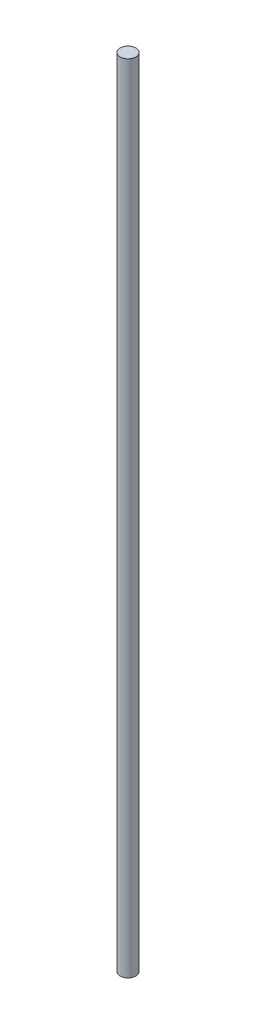
ISO-10303-21;
HEADER;
FILE_DESCRIPTION(('STEP AP214'),'2;1');
FILE_NAME('part.step','',(''),(''),'','','');
FILE_SCHEMA(('AUTOMOTIVE_DESIGN { 1 0 10303 214 1 1 1 1 }'));
ENDSEC;
DATA;
#1=APPLICATION_CONTEXT('core data for automotive mechanical design processes');
#2=APPLICATION_PROTOCOL_DEFINITION('international standard','automotive_design',2000,#1);
#3=PRODUCT_CONTEXT('',#1,'mechanical');
#4=PRODUCT('Part','Part','',(#3));
#5=PRODUCT_RELATED_PRODUCT_CATEGORY('part','',(#4));
#6=PRODUCT_DEFINITION_FORMATION('','',#4);
#7=PRODUCT_DEFINITION_CONTEXT('part definition',#1,'design');
#8=PRODUCT_DEFINITION('design','',#6,#7);
#9=PRODUCT_DEFINITION_SHAPE('','',#8);
#10=(LENGTH_UNIT() NAMED_UNIT(*) SI_UNIT(.MILLI.,.METRE.));
#11=(NAMED_UNIT(*) PLANE_ANGLE_UNIT() SI_UNIT($,.RADIAN.));
#12=(NAMED_UNIT(*) SI_UNIT($,.STERADIAN.) SOLID_ANGLE_UNIT());
#13=UNCERTAINTY_MEASURE_WITH_UNIT(LENGTH_MEASURE(1.E-05),#10,'distance_accuracy_value','');
#14=(GEOMETRIC_REPRESENTATION_CONTEXT(3) GLOBAL_UNCERTAINTY_ASSIGNED_CONTEXT((#13)) GLOBAL_UNIT_ASSIGNED_CONTEXT((#10,
#11,#12)) REPRESENTATION_CONTEXT('',''));
#15=CARTESIAN_POINT('',(0.,0.,0.));
#16=DIRECTION('',(0.,0.,1.));
#17=DIRECTION('',(1.,0.,0.));
#18=AXIS2_PLACEMENT_3D('',#15,#16,#17);
#19=CARTESIAN_POINT('',(0.,405.,0.));
#20=DIRECTION('',(0.,-1.,0.));
#21=DIRECTION('',(0.,0.,-1.));
#22=AXIS2_PLACEMENT_3D('',#19,#20,#21);
#23=CYLINDRICAL_SURFACE('',#22,4.);
#24=CARTESIAN_POINT('',(0.,405.,0.));
#25=DIRECTION('',(0.,1.,0.));
#26=DIRECTION('',(0.,0.,1.));
#27=AXIS2_PLACEMENT_3D('',#24,#25,#26);
#28=CIRCLE('',#27,4.);
#29=CARTESIAN_POINT('',(0.,405.,4.));
#30=VERTEX_POINT('',#29);
#31=EDGE_CURVE('E12',#30,#30,#28,.T.);
#32=ORIENTED_EDGE('',*,*,#31,.F.);
#33=EDGE_LOOP('',(#32));
#34=FACE_BOUND('',#33,.T.);
#35=CARTESIAN_POINT('',(0.,0.,0.));
#36=DIRECTION('',(0.,1.,0.));
#37=DIRECTION('',(0.,0.,1.));
#38=AXIS2_PLACEMENT_3D('',#35,#36,#37);
#39=CIRCLE('',#38,4.);
#40=CARTESIAN_POINT('',(0.,0.,4.));
#41=VERTEX_POINT('',#40);
#42=EDGE_CURVE('E44',#41,#41,#39,.T.);
#43=ORIENTED_EDGE('',*,*,#42,.T.);
#44=EDGE_LOOP('',(#43));
#45=FACE_BOUND('',#44,.T.);
#46=ADVANCED_FACE('F41',(#34,#45),#23,.T.);
#47=CARTESIAN_POINT('',(0.,405.,0.));
#48=DIRECTION('',(0.,1.,0.));
#49=DIRECTION('',(0.,0.,1.));
#50=AXIS2_PLACEMENT_3D('',#47,#48,#49);
#51=PLANE('',#50);
#52=ORIENTED_EDGE('',*,*,#31,.T.);
#53=EDGE_LOOP('',(#52));
#54=FACE_BOUND('',#53,.T.);
#55=ADVANCED_FACE('F56',(#54),#51,.T.);
#56=CARTESIAN_POINT('',(0.,0.,0.));
#57=DIRECTION('',(0.,1.,0.));
#58=DIRECTION('',(0.,0.,1.));
#59=AXIS2_PLACEMENT_3D('',#56,#57,#58);
#60=PLANE('',#59);
#61=ORIENTED_EDGE('',*,*,#42,.F.);
#62=EDGE_LOOP('',(#61));
#63=FACE_BOUND('',#62,.T.);
#64=ADVANCED_FACE('F54',(#63),#60,.F.);
#65=CLOSED_SHELL('',(#46,#55,#64));
#66=MANIFOLD_SOLID_BREP('B2',#65);
#67=ADVANCED_BREP_SHAPE_REPRESENTATION('',(#18,#66),#14);
#68=SHAPE_DEFINITION_REPRESENTATION(#9,#67);
ENDSEC;
END-ISO-10303-21;
